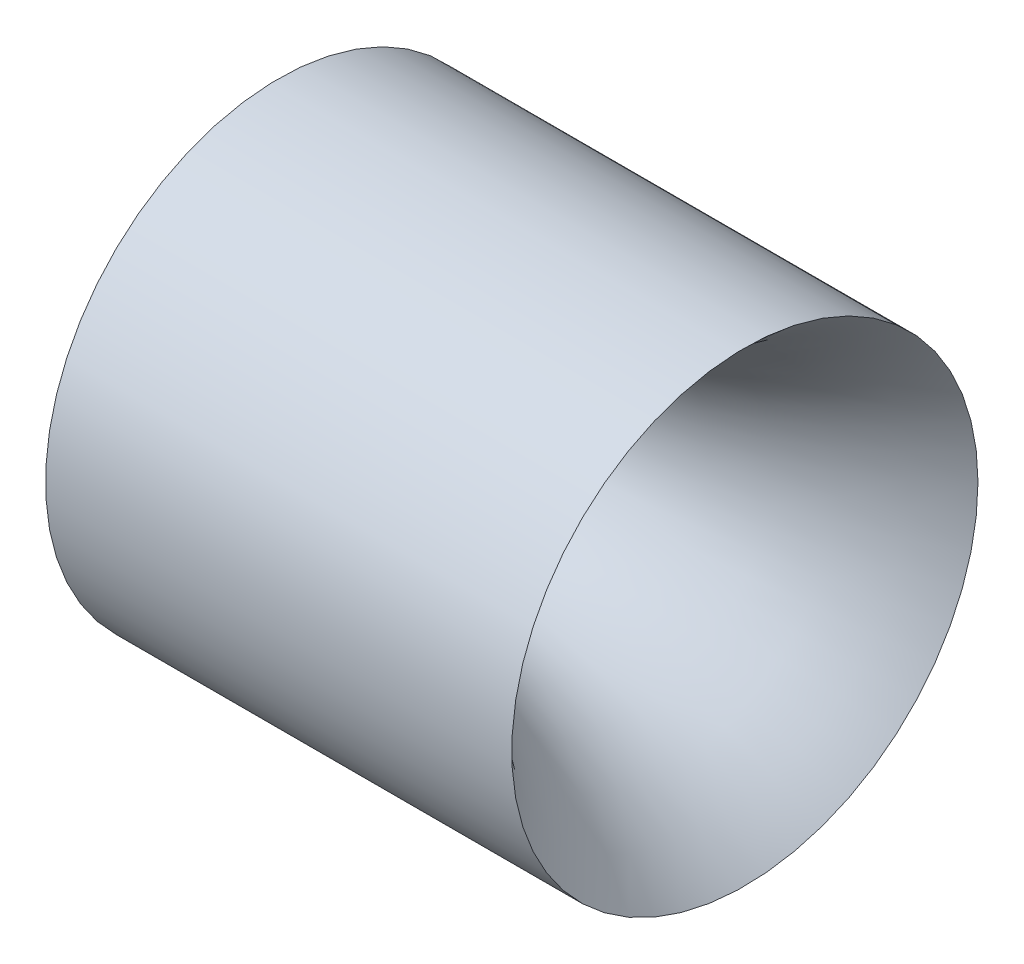
ISO-10303-21;
HEADER;
FILE_DESCRIPTION(('STEP AP214'),'2;1');
FILE_NAME('part.step','',(''),(''),'','','');
FILE_SCHEMA(('AUTOMOTIVE_DESIGN { 1 0 10303 214 1 1 1 1 }'));
ENDSEC;
DATA;
#1=APPLICATION_CONTEXT('core data for automotive mechanical design processes');
#2=APPLICATION_PROTOCOL_DEFINITION('international standard','automotive_design',2000,#1);
#3=PRODUCT_CONTEXT('',#1,'mechanical');
#4=PRODUCT('Part','Part','',(#3));
#5=PRODUCT_RELATED_PRODUCT_CATEGORY('part','',(#4));
#6=PRODUCT_DEFINITION_FORMATION('','',#4);
#7=PRODUCT_DEFINITION_CONTEXT('part definition',#1,'design');
#8=PRODUCT_DEFINITION('design','',#6,#7);
#9=PRODUCT_DEFINITION_SHAPE('','',#8);
#10=(LENGTH_UNIT() NAMED_UNIT(*) SI_UNIT(.MILLI.,.METRE.));
#11=(NAMED_UNIT(*) PLANE_ANGLE_UNIT() SI_UNIT($,.RADIAN.));
#12=(NAMED_UNIT(*) SI_UNIT($,.STERADIAN.) SOLID_ANGLE_UNIT());
#13=UNCERTAINTY_MEASURE_WITH_UNIT(LENGTH_MEASURE(1.E-05),#10,'distance_accuracy_value','');
#14=(GEOMETRIC_REPRESENTATION_CONTEXT(3) GLOBAL_UNCERTAINTY_ASSIGNED_CONTEXT((#13)) GLOBAL_UNIT_ASSIGNED_CONTEXT((#10,
#11,#12)) REPRESENTATION_CONTEXT('',''));
#15=CARTESIAN_POINT('',(0.,0.,0.));
#16=DIRECTION('',(0.,0.,1.));
#17=DIRECTION('',(1.,0.,0.));
#18=AXIS2_PLACEMENT_3D('',#15,#16,#17);
#19=CARTESIAN_POINT('',(0.,0.,0.));
#20=DIRECTION('',(1.,0.,0.));
#21=DIRECTION('',(0.,0.,-1.));
#22=AXIS2_PLACEMENT_3D('',#19,#20,#21);
#23=PLANE('',#22);
#24=CARTESIAN_POINT('',(0.,0.,0.));
#25=DIRECTION('',(1.,0.,0.));
#26=DIRECTION('',(0.,0.,-1.));
#27=AXIS2_PLACEMENT_3D('',#24,#25,#26);
#28=CIRCLE('',#27,5.);
#29=CARTESIAN_POINT('',(0.,0.,-5.));
#30=VERTEX_POINT('',#29);
#31=EDGE_CURVE('E48',#30,#30,#28,.T.);
#32=ORIENTED_EDGE('',*,*,#31,.F.);
#33=EDGE_LOOP('',(#32));
#34=FACE_BOUND('',#33,.T.);
#35=CARTESIAN_POINT('',(0.,0.,0.));
#36=DIRECTION('',(1.,0.,0.));
#37=DIRECTION('',(0.,0.,-1.));
#38=AXIS2_PLACEMENT_3D('',#35,#36,#37);
#39=CIRCLE('',#38,2.2);
#40=CARTESIAN_POINT('',(0.,0.,-2.2));
#41=VERTEX_POINT('',#40);
#42=EDGE_CURVE('E53',#41,#41,#39,.T.);
#43=ORIENTED_EDGE('',*,*,#42,.T.);
#44=EDGE_LOOP('',(#43));
#45=FACE_BOUND('',#44,.T.);
#46=ADVANCED_FACE('F37',(#34,#45),#23,.F.);
#47=CARTESIAN_POINT('',(10.,0.,0.));
#48=DIRECTION('',(-1.,0.,0.));
#49=DIRECTION('',(0.,0.,1.));
#50=AXIS2_PLACEMENT_3D('',#47,#48,#49);
#51=CYLINDRICAL_SURFACE('',#50,5.);
#52=CARTESIAN_POINT('',(10.,0.,0.));
#53=DIRECTION('',(1.,0.,0.));
#54=DIRECTION('',(0.,0.,-1.));
#55=AXIS2_PLACEMENT_3D('',#52,#53,#54);
#56=CIRCLE('',#55,5.);
#57=CARTESIAN_POINT('',(10.,0.,-5.));
#58=VERTEX_POINT('',#57);
#59=EDGE_CURVE('E44',#58,#58,#56,.T.);
#60=ORIENTED_EDGE('',*,*,#59,.F.);
#61=EDGE_LOOP('',(#60));
#62=FACE_BOUND('',#61,.T.);
#63=ORIENTED_EDGE('',*,*,#31,.T.);
#64=EDGE_LOOP('',(#63));
#65=FACE_BOUND('',#64,.T.);
#66=ADVANCED_FACE('F61',(#62,#65),#51,.T.);
#67=CARTESIAN_POINT('',(10.,0.,0.));
#68=DIRECTION('',(-1.,0.,0.));
#69=DIRECTION('',(0.,0.,1.));
#70=AXIS2_PLACEMENT_3D('',#67,#68,#69);
#71=CYLINDRICAL_SURFACE('',#70,2.2);
#72=CARTESIAN_POINT('',(3.06025937084101,0.,0.));
#73=DIRECTION('',(1.,0.,0.));
#74=DIRECTION('',(0.,0.,-1.));
#75=AXIS2_PLACEMENT_3D('',#72,#73,#74);
#76=CIRCLE('',#75,2.2);
#77=CARTESIAN_POINT('',(3.06025937084101,0.,-2.2));
#78=VERTEX_POINT('',#77);
#79=EDGE_CURVE('E10',#78,#78,#76,.T.);
#80=ORIENTED_EDGE('',*,*,#79,.T.);
#81=EDGE_LOOP('',(#80));
#82=FACE_BOUND('',#81,.T.);
#83=ORIENTED_EDGE('',*,*,#42,.F.);
#84=EDGE_LOOP('',(#83));
#85=FACE_BOUND('',#84,.T.);
#86=ADVANCED_FACE('F59',(#82,#85),#71,.F.);
#87=CARTESIAN_POINT('',(3.06025937084101,0.,0.));
#88=DIRECTION('',(1.,0.,0.));
#89=DIRECTION('',(0.,0.,-1.));
#90=AXIS2_PLACEMENT_3D('',#87,#88,#89);
#91=TOROIDAL_SURFACE('',#90,12.2,10.);
#92=ORIENTED_EDGE('',*,*,#59,.T.);
#93=EDGE_LOOP('',(#92));
#94=FACE_BOUND('',#93,.T.);
#95=ORIENTED_EDGE('',*,*,#79,.F.);
#96=EDGE_LOOP('',(#95));
#97=FACE_BOUND('',#96,.T.);
#98=ADVANCED_FACE('F39',(#94,#97),#91,.T.);
#99=CLOSED_SHELL('',(#46,#66,#86,#98));
#100=MANIFOLD_SOLID_BREP('B2',#99);
#101=ADVANCED_BREP_SHAPE_REPRESENTATION('',(#18,#100),#14);
#102=SHAPE_DEFINITION_REPRESENTATION(#9,#101);
ENDSEC;
END-ISO-10303-21;
